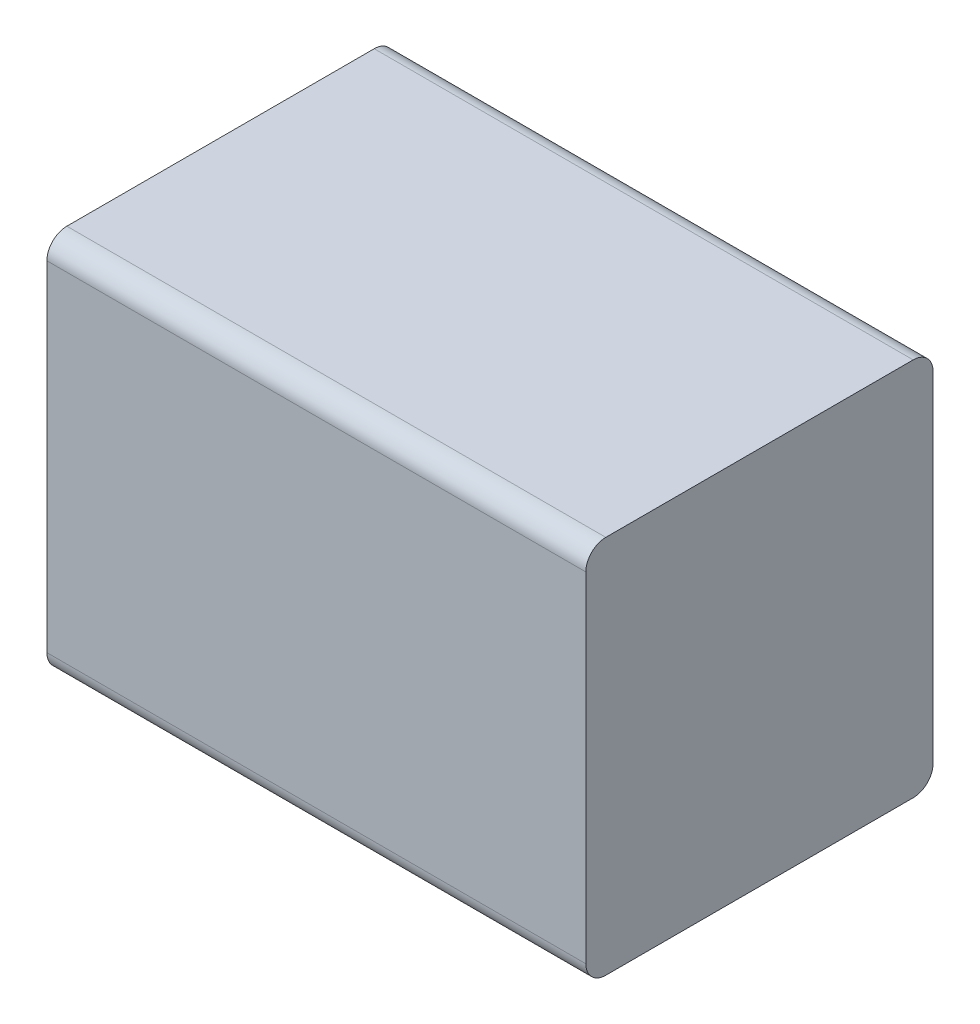
ISO-10303-21;
HEADER;
FILE_DESCRIPTION(('STEP AP214'),'2;1');
FILE_NAME('part.step','',(''),(''),'','','');
FILE_SCHEMA(('AUTOMOTIVE_DESIGN { 1 0 10303 214 1 1 1 1 }'));
ENDSEC;
DATA;
#1=APPLICATION_CONTEXT('core data for automotive mechanical design processes');
#2=APPLICATION_PROTOCOL_DEFINITION('international standard','automotive_design',2000,#1);
#3=PRODUCT_CONTEXT('',#1,'mechanical');
#4=PRODUCT('Part','Part','',(#3));
#5=PRODUCT_RELATED_PRODUCT_CATEGORY('part','',(#4));
#6=PRODUCT_DEFINITION_FORMATION('','',#4);
#7=PRODUCT_DEFINITION_CONTEXT('part definition',#1,'design');
#8=PRODUCT_DEFINITION('design','',#6,#7);
#9=PRODUCT_DEFINITION_SHAPE('','',#8);
#10=(LENGTH_UNIT() NAMED_UNIT(*) SI_UNIT(.MILLI.,.METRE.));
#11=(NAMED_UNIT(*) PLANE_ANGLE_UNIT() SI_UNIT($,.RADIAN.));
#12=(NAMED_UNIT(*) SI_UNIT($,.STERADIAN.) SOLID_ANGLE_UNIT());
#13=UNCERTAINTY_MEASURE_WITH_UNIT(LENGTH_MEASURE(1.E-05),#10,'distance_accuracy_value','');
#14=(GEOMETRIC_REPRESENTATION_CONTEXT(3) GLOBAL_UNCERTAINTY_ASSIGNED_CONTEXT((#13)) GLOBAL_UNIT_ASSIGNED_CONTEXT((#10,
#11,#12)) REPRESENTATION_CONTEXT('',''));
#15=CARTESIAN_POINT('',(0.,0.,0.));
#16=DIRECTION('',(0.,0.,1.));
#17=DIRECTION('',(1.,0.,0.));
#18=AXIS2_PLACEMENT_3D('',#15,#16,#17);
#19=CARTESIAN_POINT('',(0.,0.,0.));
#20=DIRECTION('',(0.,1.,0.));
#21=DIRECTION('',(1.,0.,0.));
#22=AXIS2_PLACEMENT_3D('',#19,#20,#21);
#23=PLANE('',#22);
#24=DIRECTION('',(0.,0.,1.));
#25=VECTOR('',#24,1.);
#26=CARTESIAN_POINT('',(1.55,0.,0.));
#27=LINE('',#26,#25);
#28=CARTESIAN_POINT('',(1.55,0.,0.05));
#29=VERTEX_POINT('',#28);
#30=CARTESIAN_POINT('',(1.55,0.,0.82));
#31=VERTEX_POINT('',#30);
#32=EDGE_CURVE('E11',#29,#31,#27,.T.);
#33=ORIENTED_EDGE('',*,*,#32,.T.);
#34=DIRECTION('',(1.,0.,0.));
#35=VECTOR('',#34,1.);
#36=CARTESIAN_POINT('',(0.,0.,0.82));
#37=LINE('',#36,#35);
#38=CARTESIAN_POINT('',(0.2,0.,0.82));
#39=VERTEX_POINT('',#38);
#40=EDGE_CURVE('E42',#39,#31,#37,.T.);
#41=ORIENTED_EDGE('',*,*,#40,.F.);
#42=DIRECTION('',(0.,0.,1.));
#43=VECTOR('',#42,1.);
#44=CARTESIAN_POINT('',(0.2,0.,0.));
#45=LINE('',#44,#43);
#46=CARTESIAN_POINT('',(0.2,0.,0.05));
#47=VERTEX_POINT('',#46);
#48=EDGE_CURVE('E138',#47,#39,#45,.T.);
#49=ORIENTED_EDGE('',*,*,#48,.F.);
#50=DIRECTION('',(1.,0.,0.));
#51=VECTOR('',#50,1.);
#52=CARTESIAN_POINT('',(0.,0.,0.05));
#53=LINE('',#52,#51);
#54=EDGE_CURVE('E28',#47,#29,#53,.T.);
#55=ORIENTED_EDGE('',*,*,#54,.T.);
#56=EDGE_LOOP('',(#33,#41,#49,#55));
#57=FACE_BOUND('',#56,.T.);
#58=ADVANCED_FACE('F17',(#57),#23,.F.);
#59=CARTESIAN_POINT('',(0.,0.05,0.05));
#60=DIRECTION('',(1.,0.,0.));
#61=DIRECTION('',(0.,-1.,0.));
#62=AXIS2_PLACEMENT_3D('',#59,#60,#61);
#63=CYLINDRICAL_SURFACE('',#62,0.05);
#64=ORIENTED_EDGE('',*,*,#54,.F.);
#65=CARTESIAN_POINT('',(0.2,0.05,0.05));
#66=DIRECTION('',(1.,0.,0.));
#67=DIRECTION('',(0.,-1.,0.));
#68=AXIS2_PLACEMENT_3D('',#65,#66,#67);
#69=CIRCLE('',#68,0.05);
#70=CARTESIAN_POINT('',(0.2,0.05,0.));
#71=VERTEX_POINT('',#70);
#72=EDGE_CURVE('E163',#47,#71,#69,.T.);
#73=ORIENTED_EDGE('',*,*,#72,.T.);
#74=DIRECTION('',(1.,0.,0.));
#75=VECTOR('',#74,1.);
#76=CARTESIAN_POINT('',(0.,0.05,0.));
#77=LINE('',#76,#75);
#78=CARTESIAN_POINT('',(1.55,0.05,0.));
#79=VERTEX_POINT('',#78);
#80=EDGE_CURVE('E21',#71,#79,#77,.T.);
#81=ORIENTED_EDGE('',*,*,#80,.T.);
#82=CARTESIAN_POINT('',(1.55,0.05,0.05));
#83=DIRECTION('',(1.,0.,0.));
#84=DIRECTION('',(0.,-1.,0.));
#85=AXIS2_PLACEMENT_3D('',#82,#83,#84);
#86=CIRCLE('',#85,0.05);
#87=EDGE_CURVE('E79',#29,#79,#86,.T.);
#88=ORIENTED_EDGE('',*,*,#87,.F.);
#89=EDGE_LOOP('',(#64,#73,#81,#88));
#90=FACE_BOUND('',#89,.T.);
#91=ADVANCED_FACE('F19',(#90),#63,.T.);
#92=CARTESIAN_POINT('',(1.55,0.,0.));
#93=DIRECTION('',(1.,0.,0.));
#94=DIRECTION('',(0.,1.,0.));
#95=AXIS2_PLACEMENT_3D('',#92,#93,#94);
#96=PLANE('',#95);
#97=ORIENTED_EDGE('',*,*,#32,.F.);
#98=ORIENTED_EDGE('',*,*,#87,.T.);
#99=DIRECTION('',(0.,1.,0.));
#100=VECTOR('',#99,1.);
#101=CARTESIAN_POINT('',(1.55,0.,0.));
#102=LINE('',#101,#100);
#103=CARTESIAN_POINT('',(1.55,0.9,0.));
#104=VERTEX_POINT('',#103);
#105=EDGE_CURVE('E155',#79,#104,#102,.T.);
#106=ORIENTED_EDGE('',*,*,#105,.T.);
#107=CARTESIAN_POINT('',(1.55,0.9,0.05));
#108=DIRECTION('',(1.,0.,0.));
#109=DIRECTION('',(0.,1.,0.));
#110=AXIS2_PLACEMENT_3D('',#107,#108,#109);
#111=CIRCLE('',#110,0.05);
#112=CARTESIAN_POINT('',(1.55,0.95,0.05));
#113=VERTEX_POINT('',#112);
#114=EDGE_CURVE('E153',#104,#113,#111,.T.);
#115=ORIENTED_EDGE('',*,*,#114,.T.);
#116=DIRECTION('',(0.,0.,1.));
#117=VECTOR('',#116,1.);
#118=CARTESIAN_POINT('',(1.55,0.95,0.));
#119=LINE('',#118,#117);
#120=CARTESIAN_POINT('',(1.55,0.95,0.82));
#121=VERTEX_POINT('',#120);
#122=EDGE_CURVE('E150',#113,#121,#119,.T.);
#123=ORIENTED_EDGE('',*,*,#122,.T.);
#124=CARTESIAN_POINT('',(1.55,0.9,0.82));
#125=DIRECTION('',(1.,0.,0.));
#126=DIRECTION('',(0.,1.,0.));
#127=AXIS2_PLACEMENT_3D('',#124,#125,#126);
#128=CIRCLE('',#127,0.05);
#129=CARTESIAN_POINT('',(1.55,0.9,0.87));
#130=VERTEX_POINT('',#129);
#131=EDGE_CURVE('E154',#121,#130,#128,.T.);
#132=ORIENTED_EDGE('',*,*,#131,.T.);
#133=DIRECTION('',(0.,1.,0.));
#134=VECTOR('',#133,1.);
#135=CARTESIAN_POINT('',(1.55,0.,0.87));
#136=LINE('',#135,#134);
#137=CARTESIAN_POINT('',(1.55,0.05,0.87));
#138=VERTEX_POINT('',#137);
#139=EDGE_CURVE('E128',#138,#130,#136,.T.);
#140=ORIENTED_EDGE('',*,*,#139,.F.);
#141=CARTESIAN_POINT('',(1.55,0.05,0.82));
#142=DIRECTION('',(1.,0.,0.));
#143=DIRECTION('',(0.,-1.,0.));
#144=AXIS2_PLACEMENT_3D('',#141,#142,#143);
#145=CIRCLE('',#144,0.05);
#146=EDGE_CURVE('E166',#138,#31,#145,.T.);
#147=ORIENTED_EDGE('',*,*,#146,.T.);
#148=EDGE_LOOP('',(#97,#98,#106,#115,#123,#132,#140,#147));
#149=FACE_BOUND('',#148,.T.);
#150=ADVANCED_FACE('F202',(#149),#96,.T.);
#151=CARTESIAN_POINT('',(0.,0.05,0.82));
#152=DIRECTION('',(1.,0.,0.));
#153=DIRECTION('',(0.,-1.,0.));
#154=AXIS2_PLACEMENT_3D('',#151,#152,#153);
#155=CYLINDRICAL_SURFACE('',#154,0.05);
#156=ORIENTED_EDGE('',*,*,#40,.T.);
#157=ORIENTED_EDGE('',*,*,#146,.F.);
#158=DIRECTION('',(1.,0.,0.));
#159=VECTOR('',#158,1.);
#160=CARTESIAN_POINT('',(0.,0.05,0.87));
#161=LINE('',#160,#159);
#162=CARTESIAN_POINT('',(0.2,0.05,0.87));
#163=VERTEX_POINT('',#162);
#164=EDGE_CURVE('E160',#163,#138,#161,.T.);
#165=ORIENTED_EDGE('',*,*,#164,.F.);
#166=CARTESIAN_POINT('',(0.2,0.05,0.82));
#167=DIRECTION('',(1.,0.,0.));
#168=DIRECTION('',(0.,-1.,0.));
#169=AXIS2_PLACEMENT_3D('',#166,#167,#168);
#170=CIRCLE('',#169,0.05);
#171=EDGE_CURVE('E134',#163,#39,#170,.T.);
#172=ORIENTED_EDGE('',*,*,#171,.T.);
#173=EDGE_LOOP('',(#156,#157,#165,#172));
#174=FACE_BOUND('',#173,.T.);
#175=ADVANCED_FACE('F217',(#174),#155,.T.);
#176=CARTESIAN_POINT('',(0.2,0.,0.));
#177=DIRECTION('',(1.,0.,0.));
#178=DIRECTION('',(0.,1.,0.));
#179=AXIS2_PLACEMENT_3D('',#176,#177,#178);
#180=PLANE('',#179);
#181=ORIENTED_EDGE('',*,*,#171,.F.);
#182=DIRECTION('',(0.,1.,0.));
#183=VECTOR('',#182,1.);
#184=CARTESIAN_POINT('',(0.2,0.,0.87));
#185=LINE('',#184,#183);
#186=CARTESIAN_POINT('',(0.2,0.9,0.87));
#187=VERTEX_POINT('',#186);
#188=EDGE_CURVE('E132',#163,#187,#185,.T.);
#189=ORIENTED_EDGE('',*,*,#188,.T.);
#190=CARTESIAN_POINT('',(0.2,0.9,0.82));
#191=DIRECTION('',(1.,0.,0.));
#192=DIRECTION('',(0.,1.,0.));
#193=AXIS2_PLACEMENT_3D('',#190,#191,#192);
#194=CIRCLE('',#193,0.05);
#195=CARTESIAN_POINT('',(0.2,0.95,0.82));
#196=VERTEX_POINT('',#195);
#197=EDGE_CURVE('E120',#196,#187,#194,.T.);
#198=ORIENTED_EDGE('',*,*,#197,.F.);
#199=DIRECTION('',(0.,0.,1.));
#200=VECTOR('',#199,1.);
#201=CARTESIAN_POINT('',(0.2,0.95,0.));
#202=LINE('',#201,#200);
#203=CARTESIAN_POINT('',(0.2,0.95,0.05));
#204=VERTEX_POINT('',#203);
#205=EDGE_CURVE('E113',#204,#196,#202,.T.);
#206=ORIENTED_EDGE('',*,*,#205,.F.);
#207=CARTESIAN_POINT('',(0.2,0.9,0.05));
#208=DIRECTION('',(1.,0.,0.));
#209=DIRECTION('',(0.,1.,0.));
#210=AXIS2_PLACEMENT_3D('',#207,#208,#209);
#211=CIRCLE('',#210,0.05);
#212=CARTESIAN_POINT('',(0.2,0.9,0.));
#213=VERTEX_POINT('',#212);
#214=EDGE_CURVE('E179',#213,#204,#211,.T.);
#215=ORIENTED_EDGE('',*,*,#214,.F.);
#216=DIRECTION('',(0.,1.,0.));
#217=VECTOR('',#216,1.);
#218=CARTESIAN_POINT('',(0.2,0.,0.));
#219=LINE('',#218,#217);
#220=EDGE_CURVE('E175',#71,#213,#219,.T.);
#221=ORIENTED_EDGE('',*,*,#220,.F.);
#222=ORIENTED_EDGE('',*,*,#72,.F.);
#223=ORIENTED_EDGE('',*,*,#48,.T.);
#224=EDGE_LOOP('',(#181,#189,#198,#206,#215,#221,#222,#223));
#225=FACE_BOUND('',#224,.T.);
#226=ADVANCED_FACE('F133',(#225),#180,.F.);
#227=CARTESIAN_POINT('',(0.,0.,0.));
#228=DIRECTION('',(0.,0.,1.));
#229=DIRECTION('',(1.,0.,0.));
#230=AXIS2_PLACEMENT_3D('',#227,#228,#229);
#231=PLANE('',#230);
#232=DIRECTION('',(1.,0.,0.));
#233=VECTOR('',#232,1.);
#234=CARTESIAN_POINT('',(0.,0.9,0.));
#235=LINE('',#234,#233);
#236=EDGE_CURVE('E185',#213,#104,#235,.T.);
#237=ORIENTED_EDGE('',*,*,#236,.T.);
#238=ORIENTED_EDGE('',*,*,#105,.F.);
#239=ORIENTED_EDGE('',*,*,#80,.F.);
#240=ORIENTED_EDGE('',*,*,#220,.T.);
#241=EDGE_LOOP('',(#237,#238,#239,#240));
#242=FACE_BOUND('',#241,.T.);
#243=ADVANCED_FACE('F208',(#242),#231,.F.);
#244=CARTESIAN_POINT('',(0.,0.,0.87));
#245=DIRECTION('',(0.,0.,1.));
#246=DIRECTION('',(1.,0.,0.));
#247=AXIS2_PLACEMENT_3D('',#244,#245,#246);
#248=PLANE('',#247);
#249=ORIENTED_EDGE('',*,*,#188,.F.);
#250=ORIENTED_EDGE('',*,*,#164,.T.);
#251=ORIENTED_EDGE('',*,*,#139,.T.);
#252=DIRECTION('',(1.,0.,0.));
#253=VECTOR('',#252,1.);
#254=CARTESIAN_POINT('',(0.,0.9,0.87));
#255=LINE('',#254,#253);
#256=EDGE_CURVE('E124',#187,#130,#255,.T.);
#257=ORIENTED_EDGE('',*,*,#256,.F.);
#258=EDGE_LOOP('',(#249,#250,#251,#257));
#259=FACE_BOUND('',#258,.T.);
#260=ADVANCED_FACE('F140',(#259),#248,.T.);
#261=CARTESIAN_POINT('',(0.,0.9,0.82));
#262=DIRECTION('',(1.,0.,0.));
#263=DIRECTION('',(0.,1.,0.));
#264=AXIS2_PLACEMENT_3D('',#261,#262,#263);
#265=CYLINDRICAL_SURFACE('',#264,0.05);
#266=DIRECTION('',(1.,0.,0.));
#267=VECTOR('',#266,1.);
#268=CARTESIAN_POINT('',(0.,0.95,0.82));
#269=LINE('',#268,#267);
#270=EDGE_CURVE('E125',#196,#121,#269,.T.);
#271=ORIENTED_EDGE('',*,*,#270,.F.);
#272=ORIENTED_EDGE('',*,*,#197,.T.);
#273=ORIENTED_EDGE('',*,*,#256,.T.);
#274=ORIENTED_EDGE('',*,*,#131,.F.);
#275=EDGE_LOOP('',(#271,#272,#273,#274));
#276=FACE_BOUND('',#275,.T.);
#277=ADVANCED_FACE('F122',(#276),#265,.T.);
#278=CARTESIAN_POINT('',(0.,0.95,0.));
#279=DIRECTION('',(0.,1.,0.));
#280=DIRECTION('',(1.,0.,0.));
#281=AXIS2_PLACEMENT_3D('',#278,#279,#280);
#282=PLANE('',#281);
#283=DIRECTION('',(1.,0.,0.));
#284=VECTOR('',#283,1.);
#285=CARTESIAN_POINT('',(0.,0.95,0.05));
#286=LINE('',#285,#284);
#287=EDGE_CURVE('E182',#204,#113,#286,.T.);
#288=ORIENTED_EDGE('',*,*,#287,.F.);
#289=ORIENTED_EDGE('',*,*,#205,.T.);
#290=ORIENTED_EDGE('',*,*,#270,.T.);
#291=ORIENTED_EDGE('',*,*,#122,.F.);
#292=EDGE_LOOP('',(#288,#289,#290,#291));
#293=FACE_BOUND('',#292,.T.);
#294=ADVANCED_FACE('F201',(#293),#282,.T.);
#295=CARTESIAN_POINT('',(0.,0.9,0.05));
#296=DIRECTION('',(1.,0.,0.));
#297=DIRECTION('',(0.,1.,0.));
#298=AXIS2_PLACEMENT_3D('',#295,#296,#297);
#299=CYLINDRICAL_SURFACE('',#298,0.05);
#300=ORIENTED_EDGE('',*,*,#287,.T.);
#301=ORIENTED_EDGE('',*,*,#114,.F.);
#302=ORIENTED_EDGE('',*,*,#236,.F.);
#303=ORIENTED_EDGE('',*,*,#214,.T.);
#304=EDGE_LOOP('',(#300,#301,#302,#303));
#305=FACE_BOUND('',#304,.T.);
#306=ADVANCED_FACE('F205',(#305),#299,.T.);
#307=CLOSED_SHELL('',(#58,#91,#150,#175,#226,#243,#260,#277,#294,#306));
#308=MANIFOLD_SOLID_BREP('B1',#307);
#309=ADVANCED_BREP_SHAPE_REPRESENTATION('',(#18,#308),#14);
#310=SHAPE_DEFINITION_REPRESENTATION(#9,#309);
ENDSEC;
END-ISO-10303-21;
